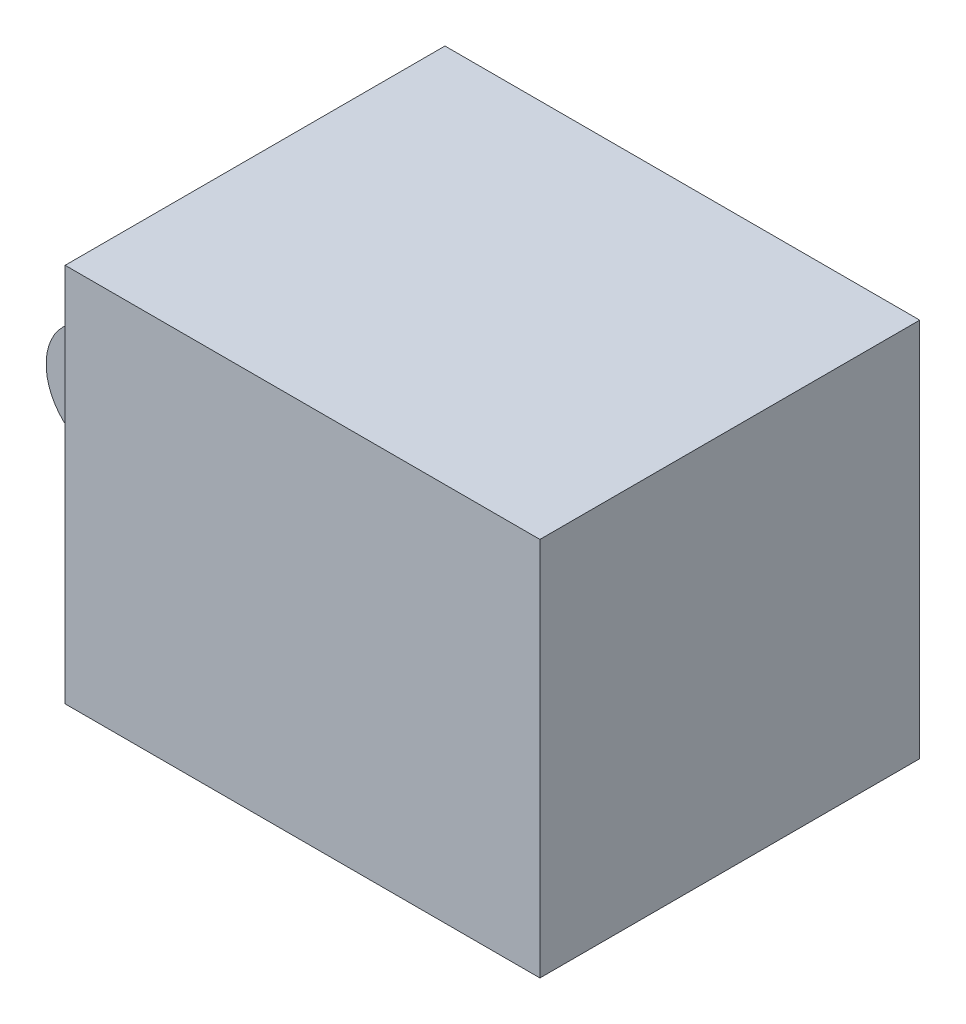
ISO-10303-21;
HEADER;
FILE_DESCRIPTION(('STEP AP214'),'2;1');
FILE_NAME('part.step','',(''),(''),'','','');
FILE_SCHEMA(('AUTOMOTIVE_DESIGN { 1 0 10303 214 1 1 1 1 }'));
ENDSEC;
DATA;
#1=APPLICATION_CONTEXT('core data for automotive mechanical design processes');
#2=APPLICATION_PROTOCOL_DEFINITION('international standard','automotive_design',2000,#1);
#3=PRODUCT_CONTEXT('',#1,'mechanical');
#4=PRODUCT('Part','Part','',(#3));
#5=PRODUCT_RELATED_PRODUCT_CATEGORY('part','',(#4));
#6=PRODUCT_DEFINITION_FORMATION('','',#4);
#7=PRODUCT_DEFINITION_CONTEXT('part definition',#1,'design');
#8=PRODUCT_DEFINITION('design','',#6,#7);
#9=PRODUCT_DEFINITION_SHAPE('','',#8);
#10=(LENGTH_UNIT() NAMED_UNIT(*) SI_UNIT(.MILLI.,.METRE.));
#11=(NAMED_UNIT(*) PLANE_ANGLE_UNIT() SI_UNIT($,.RADIAN.));
#12=(NAMED_UNIT(*) SI_UNIT($,.STERADIAN.) SOLID_ANGLE_UNIT());
#13=UNCERTAINTY_MEASURE_WITH_UNIT(LENGTH_MEASURE(1.E-05),#10,'distance_accuracy_value','');
#14=(GEOMETRIC_REPRESENTATION_CONTEXT(3) GLOBAL_UNCERTAINTY_ASSIGNED_CONTEXT((#13)) GLOBAL_UNIT_ASSIGNED_CONTEXT((#10,
#11,#12)) REPRESENTATION_CONTEXT('',''));
#15=CARTESIAN_POINT('',(0.,0.,0.));
#16=DIRECTION('',(0.,0.,1.));
#17=DIRECTION('',(1.,0.,0.));
#18=AXIS2_PLACEMENT_3D('',#15,#16,#17);
#19=CARTESIAN_POINT('',(0.,0.,30.));
#20=DIRECTION('',(0.,0.,-1.));
#21=DIRECTION('',(-1.,0.,0.));
#22=AXIS2_PLACEMENT_3D('',#19,#20,#21);
#23=CYLINDRICAL_SURFACE('',#22,6.);
#24=CARTESIAN_POINT('',(0.,0.,30.));
#25=DIRECTION('',(0.,0.,1.));
#26=DIRECTION('',(1.,0.,0.));
#27=AXIS2_PLACEMENT_3D('',#24,#25,#26);
#28=CIRCLE('',#27,6.);
#29=CARTESIAN_POINT('',(6.,0.,30.));
#30=VERTEX_POINT('',#29);
#31=EDGE_CURVE('E11',#30,#30,#28,.T.);
#32=ORIENTED_EDGE('',*,*,#31,.F.);
#33=EDGE_LOOP('',(#32));
#34=FACE_BOUND('',#33,.T.);
#35=CARTESIAN_POINT('',(0.,0.,-10.));
#36=DIRECTION('',(0.,0.,1.));
#37=DIRECTION('',(1.,0.,0.));
#38=AXIS2_PLACEMENT_3D('',#35,#36,#37);
#39=CIRCLE('',#38,6.);
#40=CARTESIAN_POINT('',(6.,0.,-10.));
#41=VERTEX_POINT('',#40);
#42=EDGE_CURVE('E44',#41,#41,#39,.T.);
#43=ORIENTED_EDGE('',*,*,#42,.T.);
#44=EDGE_LOOP('',(#43));
#45=FACE_BOUND('',#44,.T.);
#46=ADVANCED_FACE('F41',(#34,#45),#23,.T.);
#47=CARTESIAN_POINT('',(0.,0.,30.));
#48=DIRECTION('',(0.,0.,1.));
#49=DIRECTION('',(1.,0.,0.));
#50=AXIS2_PLACEMENT_3D('',#47,#48,#49);
#51=PLANE('',#50);
#52=ORIENTED_EDGE('',*,*,#31,.T.);
#53=EDGE_LOOP('',(#52));
#54=FACE_BOUND('',#53,.T.);
#55=ADVANCED_FACE('F56',(#54),#51,.T.);
#56=CARTESIAN_POINT('',(0.,0.,-10.));
#57=DIRECTION('',(0.,0.,1.));
#58=DIRECTION('',(1.,0.,0.));
#59=AXIS2_PLACEMENT_3D('',#56,#57,#58);
#60=PLANE('',#59);
#61=ORIENTED_EDGE('',*,*,#42,.F.);
#62=EDGE_LOOP('',(#61));
#63=FACE_BOUND('',#62,.T.);
#64=ADVANCED_FACE('F54',(#63),#60,.F.);
#65=CLOSED_SHELL('',(#46,#55,#64));
#66=MANIFOLD_SOLID_BREP('B2',#65);
#67=CARTESIAN_POINT('',(56.,0.,40.));
#68=DIRECTION('',(1.,0.,0.));
#69=DIRECTION('',(0.,1.,0.));
#70=AXIS2_PLACEMENT_3D('',#67,#68,#69);
#71=PLANE('',#70);
#72=DIRECTION('',(0.,-1.,0.));
#73=VECTOR('',#72,1.);
#74=CARTESIAN_POINT('',(56.,0.,0.));
#75=LINE('',#74,#73);
#76=CARTESIAN_POINT('',(56.,20.,0.));
#77=VERTEX_POINT('',#76);
#78=CARTESIAN_POINT('',(56.,-20.,0.));
#79=VERTEX_POINT('',#78);
#80=EDGE_CURVE('E145',#77,#79,#75,.T.);
#81=ORIENTED_EDGE('',*,*,#80,.F.);
#82=DIRECTION('',(0.,0.,-1.));
#83=VECTOR('',#82,1.);
#84=CARTESIAN_POINT('',(56.,20.,40.));
#85=LINE('',#84,#83);
#86=CARTESIAN_POINT('',(56.,20.,40.));
#87=VERTEX_POINT('',#86);
#88=EDGE_CURVE('E39',#87,#77,#85,.T.);
#89=ORIENTED_EDGE('',*,*,#88,.F.);
#90=DIRECTION('',(0.,-1.,0.));
#91=VECTOR('',#90,1.);
#92=CARTESIAN_POINT('',(56.,0.,40.));
#93=LINE('',#92,#91);
#94=CARTESIAN_POINT('',(56.,-20.,40.));
#95=VERTEX_POINT('',#94);
#96=EDGE_CURVE('E139',#87,#95,#93,.T.);
#97=ORIENTED_EDGE('',*,*,#96,.T.);
#98=DIRECTION('',(0.,0.,-1.));
#99=VECTOR('',#98,1.);
#100=CARTESIAN_POINT('',(56.,-20.,40.));
#101=LINE('',#100,#99);
#102=EDGE_CURVE('E120',#95,#79,#101,.T.);
#103=ORIENTED_EDGE('',*,*,#102,.T.);
#104=EDGE_LOOP('',(#81,#89,#97,#103));
#105=FACE_BOUND('',#104,.T.);
#106=ADVANCED_FACE('F82',(#105),#71,.T.);
#107=CARTESIAN_POINT('',(0.,20.,40.));
#108=DIRECTION('',(0.,1.,0.));
#109=DIRECTION('',(-1.,0.,0.));
#110=AXIS2_PLACEMENT_3D('',#107,#108,#109);
#111=PLANE('',#110);
#112=DIRECTION('',(1.,0.,0.));
#113=VECTOR('',#112,1.);
#114=CARTESIAN_POINT('',(0.,20.,0.));
#115=LINE('',#114,#113);
#116=CARTESIAN_POINT('',(5.99999999999999,20.,0.));
#117=VERTEX_POINT('',#116);
#118=EDGE_CURVE('E133',#117,#77,#115,.T.);
#119=ORIENTED_EDGE('',*,*,#118,.F.);
#120=DIRECTION('',(0.,0.,-1.));
#121=VECTOR('',#120,1.);
#122=CARTESIAN_POINT('',(5.99999999999999,20.,40.));
#123=LINE('',#122,#121);
#124=CARTESIAN_POINT('',(5.99999999999999,20.,40.));
#125=VERTEX_POINT('',#124);
#126=EDGE_CURVE('E90',#125,#117,#123,.T.);
#127=ORIENTED_EDGE('',*,*,#126,.F.);
#128=DIRECTION('',(1.,0.,0.));
#129=VECTOR('',#128,1.);
#130=CARTESIAN_POINT('',(0.,20.,40.));
#131=LINE('',#130,#129);
#132=EDGE_CURVE('E131',#125,#87,#131,.T.);
#133=ORIENTED_EDGE('',*,*,#132,.T.);
#134=ORIENTED_EDGE('',*,*,#88,.T.);
#135=EDGE_LOOP('',(#119,#127,#133,#134));
#136=FACE_BOUND('',#135,.T.);
#137=ADVANCED_FACE('F129',(#136),#111,.T.);
#138=CARTESIAN_POINT('',(6.,0.,40.));
#139=DIRECTION('',(1.,0.,0.));
#140=DIRECTION('',(0.,1.,0.));
#141=AXIS2_PLACEMENT_3D('',#138,#139,#140);
#142=PLANE('',#141);
#143=DIRECTION('',(0.,-1.,0.));
#144=VECTOR('',#143,1.);
#145=CARTESIAN_POINT('',(6.,0.,0.));
#146=LINE('',#145,#144);
#147=CARTESIAN_POINT('',(6.,-20.,0.));
#148=VERTEX_POINT('',#147);
#149=EDGE_CURVE('E113',#117,#148,#146,.T.);
#150=ORIENTED_EDGE('',*,*,#149,.T.);
#151=DIRECTION('',(0.,0.,-1.));
#152=VECTOR('',#151,1.);
#153=CARTESIAN_POINT('',(6.,-20.,40.));
#154=LINE('',#153,#152);
#155=CARTESIAN_POINT('',(6.,-20.,40.));
#156=VERTEX_POINT('',#155);
#157=EDGE_CURVE('E134',#156,#148,#154,.T.);
#158=ORIENTED_EDGE('',*,*,#157,.F.);
#159=DIRECTION('',(0.,-1.,0.));
#160=VECTOR('',#159,1.);
#161=CARTESIAN_POINT('',(6.,0.,40.));
#162=LINE('',#161,#160);
#163=EDGE_CURVE('E135',#125,#156,#162,.T.);
#164=ORIENTED_EDGE('',*,*,#163,.F.);
#165=ORIENTED_EDGE('',*,*,#126,.T.);
#166=EDGE_LOOP('',(#150,#158,#164,#165));
#167=FACE_BOUND('',#166,.T.);
#168=ADVANCED_FACE('F136',(#167),#142,.F.);
#169=CARTESIAN_POINT('',(0.,-20.,40.));
#170=DIRECTION('',(0.,1.,0.));
#171=DIRECTION('',(-1.,0.,0.));
#172=AXIS2_PLACEMENT_3D('',#169,#170,#171);
#173=PLANE('',#172);
#174=DIRECTION('',(1.,0.,0.));
#175=VECTOR('',#174,1.);
#176=CARTESIAN_POINT('',(0.,-20.,0.));
#177=LINE('',#176,#175);
#178=EDGE_CURVE('E141',#148,#79,#177,.T.);
#179=ORIENTED_EDGE('',*,*,#178,.T.);
#180=ORIENTED_EDGE('',*,*,#102,.F.);
#181=DIRECTION('',(1.,0.,0.));
#182=VECTOR('',#181,1.);
#183=CARTESIAN_POINT('',(0.,-20.,40.));
#184=LINE('',#183,#182);
#185=EDGE_CURVE('E98',#156,#95,#184,.T.);
#186=ORIENTED_EDGE('',*,*,#185,.F.);
#187=ORIENTED_EDGE('',*,*,#157,.T.);
#188=EDGE_LOOP('',(#179,#180,#186,#187));
#189=FACE_BOUND('',#188,.T.);
#190=ADVANCED_FACE('F154',(#189),#173,.F.);
#191=CARTESIAN_POINT('',(0.,0.,40.));
#192=DIRECTION('',(0.,0.,1.));
#193=DIRECTION('',(1.,0.,0.));
#194=AXIS2_PLACEMENT_3D('',#191,#192,#193);
#195=PLANE('',#194);
#196=ORIENTED_EDGE('',*,*,#96,.F.);
#197=ORIENTED_EDGE('',*,*,#132,.F.);
#198=ORIENTED_EDGE('',*,*,#163,.T.);
#199=ORIENTED_EDGE('',*,*,#185,.T.);
#200=EDGE_LOOP('',(#196,#197,#198,#199));
#201=FACE_BOUND('',#200,.T.);
#202=ADVANCED_FACE('F138',(#201),#195,.T.);
#203=CARTESIAN_POINT('',(0.,0.,0.));
#204=DIRECTION('',(0.,0.,1.));
#205=DIRECTION('',(1.,0.,0.));
#206=AXIS2_PLACEMENT_3D('',#203,#204,#205);
#207=PLANE('',#206);
#208=ORIENTED_EDGE('',*,*,#80,.T.);
#209=ORIENTED_EDGE('',*,*,#178,.F.);
#210=ORIENTED_EDGE('',*,*,#149,.F.);
#211=ORIENTED_EDGE('',*,*,#118,.T.);
#212=EDGE_LOOP('',(#208,#209,#210,#211));
#213=FACE_BOUND('',#212,.T.);
#214=ADVANCED_FACE('F156',(#213),#207,.F.);
#215=CLOSED_SHELL('',(#106,#137,#168,#190,#202,#214));
#216=MANIFOLD_SOLID_BREP('B6',#215);
#217=ADVANCED_BREP_SHAPE_REPRESENTATION('',(#18,#66,#216),#14);
#218=SHAPE_DEFINITION_REPRESENTATION(#9,#217);
ENDSEC;
END-ISO-10303-21;
